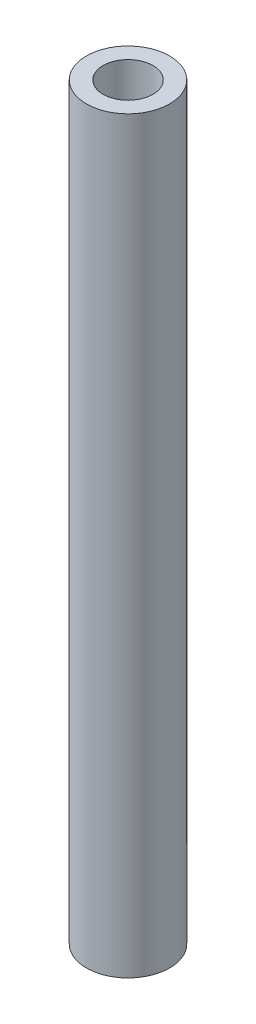
ISO-10303-21;
HEADER;
FILE_DESCRIPTION(('STEP AP214'),'2;1');
FILE_NAME('part.step','',(''),(''),'','','');
FILE_SCHEMA(('AUTOMOTIVE_DESIGN { 1 0 10303 214 1 1 1 1 }'));
ENDSEC;
DATA;
#1=APPLICATION_CONTEXT('core data for automotive mechanical design processes');
#2=APPLICATION_PROTOCOL_DEFINITION('international standard','automotive_design',2000,#1);
#3=PRODUCT_CONTEXT('',#1,'mechanical');
#4=PRODUCT('Part','Part','',(#3));
#5=PRODUCT_RELATED_PRODUCT_CATEGORY('part','',(#4));
#6=PRODUCT_DEFINITION_FORMATION('','',#4);
#7=PRODUCT_DEFINITION_CONTEXT('part definition',#1,'design');
#8=PRODUCT_DEFINITION('design','',#6,#7);
#9=PRODUCT_DEFINITION_SHAPE('','',#8);
#10=(LENGTH_UNIT() NAMED_UNIT(*) SI_UNIT(.MILLI.,.METRE.));
#11=(NAMED_UNIT(*) PLANE_ANGLE_UNIT() SI_UNIT($,.RADIAN.));
#12=(NAMED_UNIT(*) SI_UNIT($,.STERADIAN.) SOLID_ANGLE_UNIT());
#13=UNCERTAINTY_MEASURE_WITH_UNIT(LENGTH_MEASURE(1.E-05),#10,'distance_accuracy_value','');
#14=(GEOMETRIC_REPRESENTATION_CONTEXT(3) GLOBAL_UNCERTAINTY_ASSIGNED_CONTEXT((#13)) GLOBAL_UNIT_ASSIGNED_CONTEXT((#10,
#11,#12)) REPRESENTATION_CONTEXT('',''));
#15=CARTESIAN_POINT('',(0.,0.,0.));
#16=DIRECTION('',(0.,0.,1.));
#17=DIRECTION('',(1.,0.,0.));
#18=AXIS2_PLACEMENT_3D('',#15,#16,#17);
#19=CARTESIAN_POINT('',(0.,45.,0.));
#20=DIRECTION('',(0.,1.,0.));
#21=DIRECTION('',(0.,0.,1.));
#22=AXIS2_PLACEMENT_3D('',#19,#20,#21);
#23=PLANE('',#22);
#24=CARTESIAN_POINT('',(0.,45.,0.));
#25=DIRECTION('',(0.,1.,0.));
#26=DIRECTION('',(0.,0.,1.));
#27=AXIS2_PLACEMENT_3D('',#24,#25,#26);
#28=CIRCLE('',#27,2.5);
#29=CARTESIAN_POINT('',(0.,45.,-2.5));
#30=VERTEX_POINT('',#29);
#31=EDGE_CURVE('E10',#30,#30,#28,.T.);
#32=ORIENTED_EDGE('',*,*,#31,.T.);
#33=EDGE_LOOP('',(#32));
#34=FACE_BOUND('',#33,.T.);
#35=CARTESIAN_POINT('',(0.,45.,0.));
#36=DIRECTION('',(0.,1.,0.));
#37=DIRECTION('',(0.,0.,1.));
#38=AXIS2_PLACEMENT_3D('',#35,#36,#37);
#39=CIRCLE('',#38,1.5);
#40=CARTESIAN_POINT('',(0.,45.,-1.5));
#41=VERTEX_POINT('',#40);
#42=EDGE_CURVE('E48',#41,#41,#39,.T.);
#43=ORIENTED_EDGE('',*,*,#42,.F.);
#44=EDGE_LOOP('',(#43));
#45=FACE_BOUND('',#44,.T.);
#46=ADVANCED_FACE('F40',(#34,#45),#23,.T.);
#47=CARTESIAN_POINT('',(0.,0.,0.));
#48=DIRECTION('',(0.,1.,0.));
#49=DIRECTION('',(0.,0.,1.));
#50=AXIS2_PLACEMENT_3D('',#47,#48,#49);
#51=PLANE('',#50);
#52=CARTESIAN_POINT('',(0.,0.,0.));
#53=DIRECTION('',(0.,1.,0.));
#54=DIRECTION('',(0.,0.,1.));
#55=AXIS2_PLACEMENT_3D('',#52,#53,#54);
#56=CIRCLE('',#55,2.5);
#57=CARTESIAN_POINT('',(0.,0.,-2.5));
#58=VERTEX_POINT('',#57);
#59=EDGE_CURVE('E41',#58,#58,#56,.T.);
#60=ORIENTED_EDGE('',*,*,#59,.F.);
#61=EDGE_LOOP('',(#60));
#62=FACE_BOUND('',#61,.T.);
#63=CARTESIAN_POINT('',(0.,0.,0.));
#64=DIRECTION('',(0.,1.,0.));
#65=DIRECTION('',(0.,0.,1.));
#66=AXIS2_PLACEMENT_3D('',#63,#64,#65);
#67=CIRCLE('',#66,1.5);
#68=CARTESIAN_POINT('',(0.,0.,-1.5));
#69=VERTEX_POINT('',#68);
#70=EDGE_CURVE('E49',#69,#69,#67,.T.);
#71=ORIENTED_EDGE('',*,*,#70,.T.);
#72=EDGE_LOOP('',(#71));
#73=FACE_BOUND('',#72,.T.);
#74=ADVANCED_FACE('F58',(#62,#73),#51,.F.);
#75=CARTESIAN_POINT('',(0.,45.,0.));
#76=DIRECTION('',(0.,-1.,0.));
#77=DIRECTION('',(0.,0.,-1.));
#78=AXIS2_PLACEMENT_3D('',#75,#76,#77);
#79=CYLINDRICAL_SURFACE('',#78,2.5);
#80=CARTESIAN_POINT('',(0.,45.,-2.5));
#81=CARTESIAN_POINT('',(0.,44.53125,-2.5));
#82=CARTESIAN_POINT('',(0.,44.0625,-2.5));
#83=CARTESIAN_POINT('',(0.,43.125,-2.5));
#84=CARTESIAN_POINT('',(0.,42.65625,-2.5));
#85=CARTESIAN_POINT('',(0.,41.71875,-2.5));
#86=CARTESIAN_POINT('',(0.,41.25,-2.5));
#87=CARTESIAN_POINT('',(0.,40.3125,-2.5));
#88=CARTESIAN_POINT('',(0.,39.84375,-2.5));
#89=CARTESIAN_POINT('',(0.,38.90625,-2.5));
#90=CARTESIAN_POINT('',(0.,38.4375,-2.5));
#91=CARTESIAN_POINT('',(0.,37.5,-2.5));
#92=CARTESIAN_POINT('',(0.,37.03125,-2.5));
#93=CARTESIAN_POINT('',(0.,36.09375,-2.5));
#94=CARTESIAN_POINT('',(0.,35.625,-2.5));
#95=CARTESIAN_POINT('',(0.,34.6875,-2.5));
#96=CARTESIAN_POINT('',(0.,34.21875,-2.5));
#97=CARTESIAN_POINT('',(0.,33.28125,-2.5));
#98=CARTESIAN_POINT('',(0.,32.8125,-2.5));
#99=CARTESIAN_POINT('',(0.,31.875,-2.5));
#100=CARTESIAN_POINT('',(0.,31.40625,-2.5));
#101=CARTESIAN_POINT('',(0.,30.46875,-2.5));
#102=CARTESIAN_POINT('',(0.,30.,-2.5));
#103=CARTESIAN_POINT('',(0.,29.0625,-2.5));
#104=CARTESIAN_POINT('',(0.,28.59375,-2.5));
#105=CARTESIAN_POINT('',(0.,27.65625,-2.5));
#106=CARTESIAN_POINT('',(0.,27.1875,-2.5));
#107=CARTESIAN_POINT('',(0.,26.25,-2.5));
#108=CARTESIAN_POINT('',(0.,25.78125,-2.5));
#109=CARTESIAN_POINT('',(0.,24.84375,-2.5));
#110=CARTESIAN_POINT('',(0.,24.375,-2.5));
#111=CARTESIAN_POINT('',(0.,23.4375,-2.5));
#112=CARTESIAN_POINT('',(0.,22.96875,-2.5));
#113=CARTESIAN_POINT('',(0.,22.03125,-2.5));
#114=CARTESIAN_POINT('',(0.,21.5625,-2.5));
#115=CARTESIAN_POINT('',(0.,20.625,-2.5));
#116=CARTESIAN_POINT('',(0.,20.15625,-2.5));
#117=CARTESIAN_POINT('',(0.,19.21875,-2.5));
#118=CARTESIAN_POINT('',(0.,18.75,-2.5));
#119=CARTESIAN_POINT('',(0.,17.8125,-2.5));
#120=CARTESIAN_POINT('',(0.,17.34375,-2.5));
#121=CARTESIAN_POINT('',(0.,16.40625,-2.5));
#122=CARTESIAN_POINT('',(0.,15.9375,-2.5));
#123=CARTESIAN_POINT('',(0.,15.,-2.5));
#124=CARTESIAN_POINT('',(0.,14.53125,-2.5));
#125=CARTESIAN_POINT('',(0.,13.59375,-2.5));
#126=CARTESIAN_POINT('',(0.,13.125,-2.5));
#127=CARTESIAN_POINT('',(0.,12.1875,-2.5));
#128=CARTESIAN_POINT('',(0.,11.71875,-2.5));
#129=CARTESIAN_POINT('',(0.,10.78125,-2.5));
#130=CARTESIAN_POINT('',(0.,10.3125,-2.5));
#131=CARTESIAN_POINT('',(0.,9.37499999999999,-2.5));
#132=CARTESIAN_POINT('',(0.,8.90624999999999,-2.5));
#133=CARTESIAN_POINT('',(0.,7.96874999999999,-2.5));
#134=CARTESIAN_POINT('',(0.,7.5,-2.5));
#135=CARTESIAN_POINT('',(0.,6.56249999999999,-2.5));
#136=CARTESIAN_POINT('',(0.,6.09374999999999,-2.5));
#137=CARTESIAN_POINT('',(0.,5.15624999999999,-2.5));
#138=CARTESIAN_POINT('',(0.,4.68749999999999,-2.5));
#139=CARTESIAN_POINT('',(0.,3.74999999999999,-2.5));
#140=CARTESIAN_POINT('',(0.,3.28124999999999,-2.5));
#141=CARTESIAN_POINT('',(0.,2.34374999999999,-2.5));
#142=CARTESIAN_POINT('',(0.,1.87499999999999,-2.5));
#143=CARTESIAN_POINT('',(0.,0.937499999999992,-2.5));
#144=CARTESIAN_POINT('',(0.,0.468749999999993,-2.5));
#145=CARTESIAN_POINT('',(0.,0.,-2.5));
#146=B_SPLINE_CURVE_WITH_KNOTS('',3,(#80,#81,#82,#83,#84,#85,#86,#87,#88,#89,#90,#91,#92,#93,
#94,#95,#96,#97,#98,#99,#100,#101,#102,#103,#104,#105,#106,#107,#108,#109,#110,#111,#112,#113,
#114,#115,#116,#117,#118,#119,#120,#121,#122,#123,#124,#125,#126,#127,#128,#129,#130,#131,#132,
#133,#134,#135,#136,#137,#138,#139,#140,#141,#142,#143,#144,#145),.UNSPECIFIED.,.F.,.F.,(4,2,2,
2,2,2,2,2,2,2,2,2,2,2,2,2,2,2,2,2,2,2,2,2,2,2,2,2,2,2,2,2,4),(0.,1.40625,2.8125,
4.21874999999999,5.625,7.03125,8.43749999999999,9.84375,11.25,12.65625,14.0625,15.46875,16.875,
18.28125,19.6875,21.09375,22.5,23.90625,25.3125,26.71875,28.125,29.53125,30.9375,32.34375,33.75,
35.15625,36.5625,37.96875,39.375,40.78125,42.1875,43.59375,45.),.UNSPECIFIED.);
#147=EDGE_CURVE('BSEAM39',#30,#58,#146,.T.);
#148=ORIENTED_EDGE('',*,*,#31,.F.);
#149=ORIENTED_EDGE('',*,*,#59,.T.);
#150=ORIENTED_EDGE('',*,*,#147,.T.);
#151=ORIENTED_EDGE('',*,*,#147,.F.);
#152=EDGE_LOOP('',(#148,#150,#149,#151));
#153=FACE_BOUND('',#152,.T.);
#154=ADVANCED_FACE('F39',(#153),#79,.T.);
#155=CARTESIAN_POINT('',(0.,45.,0.));
#156=DIRECTION('',(0.,-1.,0.));
#157=DIRECTION('',(0.,0.,-1.));
#158=AXIS2_PLACEMENT_3D('',#155,#156,#157);
#159=CYLINDRICAL_SURFACE('',#158,1.5);
#160=CARTESIAN_POINT('',(0.,45.,-1.5));
#161=CARTESIAN_POINT('',(0.,44.53125,-1.5));
#162=CARTESIAN_POINT('',(0.,44.0625,-1.5));
#163=CARTESIAN_POINT('',(0.,43.125,-1.5));
#164=CARTESIAN_POINT('',(0.,42.65625,-1.5));
#165=CARTESIAN_POINT('',(0.,41.71875,-1.5));
#166=CARTESIAN_POINT('',(0.,41.25,-1.5));
#167=CARTESIAN_POINT('',(0.,40.3125,-1.5));
#168=CARTESIAN_POINT('',(0.,39.84375,-1.5));
#169=CARTESIAN_POINT('',(0.,38.90625,-1.5));
#170=CARTESIAN_POINT('',(0.,38.4375,-1.5));
#171=CARTESIAN_POINT('',(0.,37.5,-1.5));
#172=CARTESIAN_POINT('',(0.,37.03125,-1.5));
#173=CARTESIAN_POINT('',(0.,36.09375,-1.5));
#174=CARTESIAN_POINT('',(0.,35.625,-1.5));
#175=CARTESIAN_POINT('',(0.,34.6875,-1.5));
#176=CARTESIAN_POINT('',(0.,34.21875,-1.5));
#177=CARTESIAN_POINT('',(0.,33.28125,-1.5));
#178=CARTESIAN_POINT('',(0.,32.8125,-1.5));
#179=CARTESIAN_POINT('',(0.,31.875,-1.5));
#180=CARTESIAN_POINT('',(0.,31.40625,-1.5));
#181=CARTESIAN_POINT('',(0.,30.46875,-1.5));
#182=CARTESIAN_POINT('',(0.,30.,-1.5));
#183=CARTESIAN_POINT('',(0.,29.0625,-1.5));
#184=CARTESIAN_POINT('',(0.,28.59375,-1.5));
#185=CARTESIAN_POINT('',(0.,27.65625,-1.5));
#186=CARTESIAN_POINT('',(0.,27.1875,-1.5));
#187=CARTESIAN_POINT('',(0.,26.25,-1.5));
#188=CARTESIAN_POINT('',(0.,25.78125,-1.5));
#189=CARTESIAN_POINT('',(0.,24.84375,-1.5));
#190=CARTESIAN_POINT('',(0.,24.375,-1.5));
#191=CARTESIAN_POINT('',(0.,23.4375,-1.5));
#192=CARTESIAN_POINT('',(0.,22.96875,-1.5));
#193=CARTESIAN_POINT('',(0.,22.03125,-1.5));
#194=CARTESIAN_POINT('',(0.,21.5625,-1.5));
#195=CARTESIAN_POINT('',(0.,20.625,-1.5));
#196=CARTESIAN_POINT('',(0.,20.15625,-1.5));
#197=CARTESIAN_POINT('',(0.,19.21875,-1.5));
#198=CARTESIAN_POINT('',(0.,18.75,-1.5));
#199=CARTESIAN_POINT('',(0.,17.8125,-1.5));
#200=CARTESIAN_POINT('',(0.,17.34375,-1.5));
#201=CARTESIAN_POINT('',(0.,16.40625,-1.5));
#202=CARTESIAN_POINT('',(0.,15.9375,-1.5));
#203=CARTESIAN_POINT('',(0.,15.,-1.5));
#204=CARTESIAN_POINT('',(0.,14.53125,-1.5));
#205=CARTESIAN_POINT('',(0.,13.59375,-1.5));
#206=CARTESIAN_POINT('',(0.,13.125,-1.5));
#207=CARTESIAN_POINT('',(0.,12.1875,-1.5));
#208=CARTESIAN_POINT('',(0.,11.71875,-1.5));
#209=CARTESIAN_POINT('',(0.,10.78125,-1.5));
#210=CARTESIAN_POINT('',(0.,10.3125,-1.5));
#211=CARTESIAN_POINT('',(0.,9.37499999999999,-1.5));
#212=CARTESIAN_POINT('',(0.,8.90624999999999,-1.5));
#213=CARTESIAN_POINT('',(0.,7.96874999999999,-1.5));
#214=CARTESIAN_POINT('',(0.,7.5,-1.5));
#215=CARTESIAN_POINT('',(0.,6.56249999999999,-1.5));
#216=CARTESIAN_POINT('',(0.,6.09374999999999,-1.5));
#217=CARTESIAN_POINT('',(0.,5.15624999999999,-1.5));
#218=CARTESIAN_POINT('',(0.,4.68749999999999,-1.5));
#219=CARTESIAN_POINT('',(0.,3.74999999999999,-1.5));
#220=CARTESIAN_POINT('',(0.,3.28124999999999,-1.5));
#221=CARTESIAN_POINT('',(0.,2.34374999999999,-1.5));
#222=CARTESIAN_POINT('',(0.,1.87499999999999,-1.5));
#223=CARTESIAN_POINT('',(0.,0.937499999999992,-1.5));
#224=CARTESIAN_POINT('',(0.,0.468749999999993,-1.5));
#225=CARTESIAN_POINT('',(0.,0.,-1.5));
#226=B_SPLINE_CURVE_WITH_KNOTS('',3,(#160,#161,#162,#163,#164,#165,#166,#167,#168,#169,#170,
#171,#172,#173,#174,#175,#176,#177,#178,#179,#180,#181,#182,#183,#184,#185,#186,#187,#188,#189,
#190,#191,#192,#193,#194,#195,#196,#197,#198,#199,#200,#201,#202,#203,#204,#205,#206,#207,#208,
#209,#210,#211,#212,#213,#214,#215,#216,#217,#218,#219,#220,#221,#222,#223,#224,#225),
.UNSPECIFIED.,.F.,.F.,(4,2,2,2,2,2,2,2,2,2,2,2,2,2,2,2,2,2,2,2,2,2,2,2,2,2,2,2,2,2,2,2,4),(0.,
1.40625,2.8125,4.21874999999999,5.625,7.03125,8.43749999999999,9.84375,11.25,12.65625,14.0625,
15.46875,16.875,18.28125,19.6875,21.09375,22.5,23.90625,25.3125,26.71875,28.125,29.53125,
30.9375,32.34375,33.75,35.15625,36.5625,37.96875,39.375,40.78125,42.1875,43.59375,45.),.UNSPECIFIED.);
#227=EDGE_CURVE('BSEAM57',#41,#69,#226,.T.);
#228=ORIENTED_EDGE('',*,*,#42,.T.);
#229=ORIENTED_EDGE('',*,*,#70,.F.);
#230=ORIENTED_EDGE('',*,*,#227,.T.);
#231=ORIENTED_EDGE('',*,*,#227,.F.);
#232=EDGE_LOOP('',(#228,#230,#229,#231));
#233=FACE_BOUND('',#232,.T.);
#234=ADVANCED_FACE('F57',(#233),#159,.F.);
#235=CLOSED_SHELL('',(#46,#74,#154,#234));
#236=MANIFOLD_SOLID_BREP('B2',#235);
#237=ADVANCED_BREP_SHAPE_REPRESENTATION('',(#18,#236),#14);
#238=SHAPE_DEFINITION_REPRESENTATION(#9,#237);
ENDSEC;
END-ISO-10303-21;
